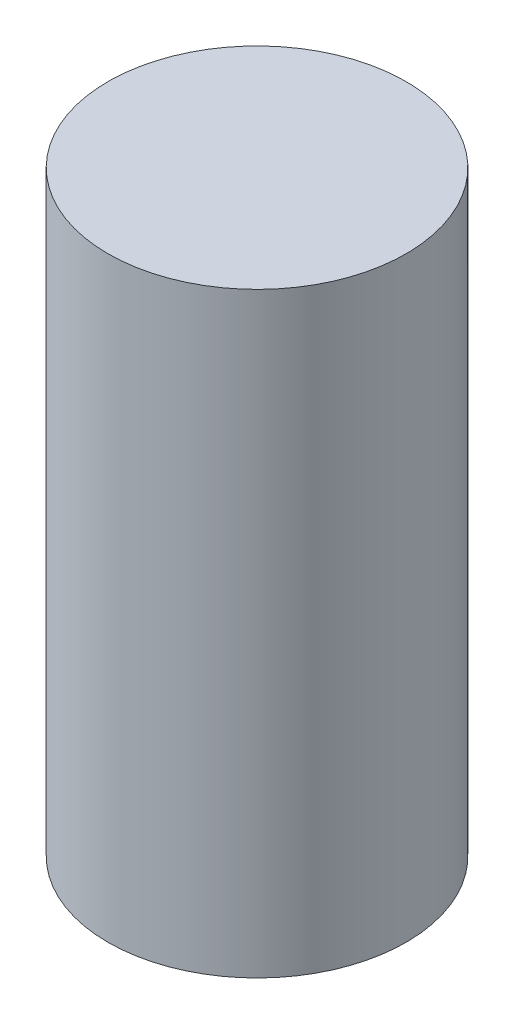
ISO-10303-21;
HEADER;
FILE_DESCRIPTION(('STEP AP214'),'2;1');
FILE_NAME('part.step','',(''),(''),'','','');
FILE_SCHEMA(('AUTOMOTIVE_DESIGN { 1 0 10303 214 1 1 1 1 }'));
ENDSEC;
DATA;
#1=APPLICATION_CONTEXT('core data for automotive mechanical design processes');
#2=APPLICATION_PROTOCOL_DEFINITION('international standard','automotive_design',2000,#1);
#3=PRODUCT_CONTEXT('',#1,'mechanical');
#4=PRODUCT('Part','Part','',(#3));
#5=PRODUCT_RELATED_PRODUCT_CATEGORY('part','',(#4));
#6=PRODUCT_DEFINITION_FORMATION('','',#4);
#7=PRODUCT_DEFINITION_CONTEXT('part definition',#1,'design');
#8=PRODUCT_DEFINITION('design','',#6,#7);
#9=PRODUCT_DEFINITION_SHAPE('','',#8);
#10=(LENGTH_UNIT() NAMED_UNIT(*) SI_UNIT(.MILLI.,.METRE.));
#11=(NAMED_UNIT(*) PLANE_ANGLE_UNIT() SI_UNIT($,.RADIAN.));
#12=(NAMED_UNIT(*) SI_UNIT($,.STERADIAN.) SOLID_ANGLE_UNIT());
#13=UNCERTAINTY_MEASURE_WITH_UNIT(LENGTH_MEASURE(1.E-05),#10,'distance_accuracy_value','');
#14=(GEOMETRIC_REPRESENTATION_CONTEXT(3) GLOBAL_UNCERTAINTY_ASSIGNED_CONTEXT((#13)) GLOBAL_UNIT_ASSIGNED_CONTEXT((#10,
#11,#12)) REPRESENTATION_CONTEXT('',''));
#15=CARTESIAN_POINT('',(0.,0.,0.));
#16=DIRECTION('',(0.,0.,1.));
#17=DIRECTION('',(1.,0.,0.));
#18=AXIS2_PLACEMENT_3D('',#15,#16,#17);
#19=CARTESIAN_POINT('',(0.,100.,0.));
#20=DIRECTION('',(0.,-1.,0.));
#21=DIRECTION('',(0.,0.,-1.));
#22=AXIS2_PLACEMENT_3D('',#19,#20,#21);
#23=CYLINDRICAL_SURFACE('',#22,25.);
#24=CARTESIAN_POINT('',(0.,100.,0.));
#25=DIRECTION('',(0.,1.,0.));
#26=DIRECTION('',(0.,0.,1.));
#27=AXIS2_PLACEMENT_3D('',#24,#25,#26);
#28=CIRCLE('',#27,25.);
#29=CARTESIAN_POINT('',(0.,100.,25.));
#30=VERTEX_POINT('',#29);
#31=EDGE_CURVE('E10',#30,#30,#28,.T.);
#32=ORIENTED_EDGE('',*,*,#31,.F.);
#33=EDGE_LOOP('',(#32));
#34=FACE_BOUND('',#33,.T.);
#35=CARTESIAN_POINT('',(0.,0.,0.));
#36=DIRECTION('',(0.,1.,0.));
#37=DIRECTION('',(0.,0.,1.));
#38=AXIS2_PLACEMENT_3D('',#35,#36,#37);
#39=CIRCLE('',#38,25.);
#40=CARTESIAN_POINT('',(0.,0.,25.));
#41=VERTEX_POINT('',#40);
#42=EDGE_CURVE('E37',#41,#41,#39,.T.);
#43=ORIENTED_EDGE('',*,*,#42,.T.);
#44=EDGE_LOOP('',(#43));
#45=FACE_BOUND('',#44,.T.);
#46=ADVANCED_FACE('F34',(#34,#45),#23,.T.);
#47=CARTESIAN_POINT('',(0.,100.,0.));
#48=DIRECTION('',(0.,1.,0.));
#49=DIRECTION('',(0.,0.,1.));
#50=AXIS2_PLACEMENT_3D('',#47,#48,#49);
#51=PLANE('',#50);
#52=ORIENTED_EDGE('',*,*,#31,.T.);
#53=EDGE_LOOP('',(#52));
#54=FACE_BOUND('',#53,.T.);
#55=ADVANCED_FACE('F49',(#54),#51,.T.);
#56=CARTESIAN_POINT('',(0.,0.,0.));
#57=DIRECTION('',(0.,1.,0.));
#58=DIRECTION('',(0.,0.,1.));
#59=AXIS2_PLACEMENT_3D('',#56,#57,#58);
#60=PLANE('',#59);
#61=ORIENTED_EDGE('',*,*,#42,.F.);
#62=EDGE_LOOP('',(#61));
#63=FACE_BOUND('',#62,.T.);
#64=ADVANCED_FACE('F47',(#63),#60,.F.);
#65=CLOSED_SHELL('',(#46,#55,#64));
#66=MANIFOLD_SOLID_BREP('B2',#65);
#67=ADVANCED_BREP_SHAPE_REPRESENTATION('',(#18,#66),#14);
#68=SHAPE_DEFINITION_REPRESENTATION(#9,#67);
ENDSEC;
END-ISO-10303-21;
